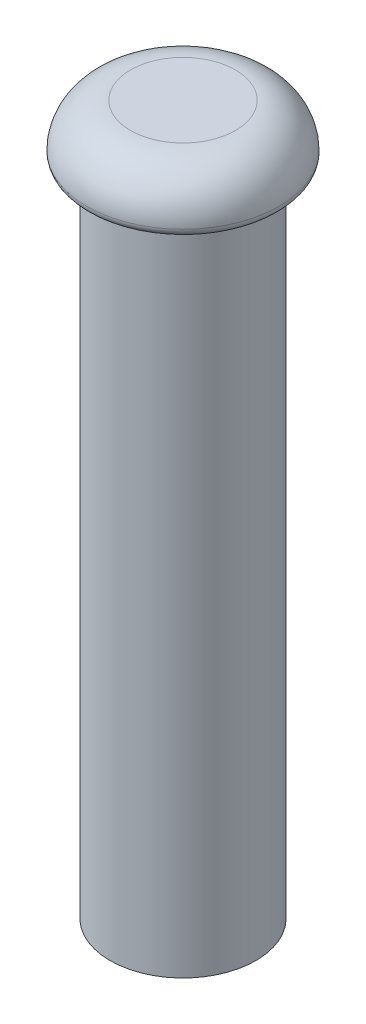
ISO-10303-21;
HEADER;
FILE_DESCRIPTION(('STEP AP214'),'2;1');
FILE_NAME('part.step','',(''),(''),'','','');
FILE_SCHEMA(('AUTOMOTIVE_DESIGN { 1 0 10303 214 1 1 1 1 }'));
ENDSEC;
DATA;
#1=APPLICATION_CONTEXT('core data for automotive mechanical design processes');
#2=APPLICATION_PROTOCOL_DEFINITION('international standard','automotive_design',2000,#1);
#3=PRODUCT_CONTEXT('',#1,'mechanical');
#4=PRODUCT('Part','Part','',(#3));
#5=PRODUCT_RELATED_PRODUCT_CATEGORY('part','',(#4));
#6=PRODUCT_DEFINITION_FORMATION('','',#4);
#7=PRODUCT_DEFINITION_CONTEXT('part definition',#1,'design');
#8=PRODUCT_DEFINITION('design','',#6,#7);
#9=PRODUCT_DEFINITION_SHAPE('','',#8);
#10=(LENGTH_UNIT() NAMED_UNIT(*) SI_UNIT(.MILLI.,.METRE.));
#11=(NAMED_UNIT(*) PLANE_ANGLE_UNIT() SI_UNIT($,.RADIAN.));
#12=(NAMED_UNIT(*) SI_UNIT($,.STERADIAN.) SOLID_ANGLE_UNIT());
#13=UNCERTAINTY_MEASURE_WITH_UNIT(LENGTH_MEASURE(1.E-05),#10,'distance_accuracy_value','');
#14=(GEOMETRIC_REPRESENTATION_CONTEXT(3) GLOBAL_UNCERTAINTY_ASSIGNED_CONTEXT((#13)) GLOBAL_UNIT_ASSIGNED_CONTEXT((#10,
#11,#12)) REPRESENTATION_CONTEXT('',''));
#15=CARTESIAN_POINT('',(0.,0.,0.));
#16=DIRECTION('',(0.,0.,1.));
#17=DIRECTION('',(1.,0.,0.));
#18=AXIS2_PLACEMENT_3D('',#15,#16,#17);
#19=CARTESIAN_POINT('',(0.,225.,0.));
#20=DIRECTION('',(0.,-1.,0.));
#21=DIRECTION('',(0.,0.,-1.));
#22=AXIS2_PLACEMENT_3D('',#19,#20,#21);
#23=CYLINDRICAL_SURFACE('',#22,25.);
#24=CARTESIAN_POINT('',(0.,225.,0.));
#25=DIRECTION('',(0.,1.,0.));
#26=DIRECTION('',(0.,0.,1.));
#27=AXIS2_PLACEMENT_3D('',#24,#25,#26);
#28=CIRCLE('',#27,25.);
#29=CARTESIAN_POINT('',(0.,225.,25.));
#30=VERTEX_POINT('',#29);
#31=EDGE_CURVE('E55',#30,#30,#28,.T.);
#32=ORIENTED_EDGE('',*,*,#31,.F.);
#33=EDGE_LOOP('',(#32));
#34=FACE_BOUND('',#33,.T.);
#35=CARTESIAN_POINT('',(0.,0.,0.));
#36=DIRECTION('',(0.,1.,0.));
#37=DIRECTION('',(0.,0.,1.));
#38=AXIS2_PLACEMENT_3D('',#35,#36,#37);
#39=CIRCLE('',#38,25.);
#40=CARTESIAN_POINT('',(0.,0.,25.));
#41=VERTEX_POINT('',#40);
#42=EDGE_CURVE('E58',#41,#41,#39,.T.);
#43=ORIENTED_EDGE('',*,*,#42,.T.);
#44=EDGE_LOOP('',(#43));
#45=FACE_BOUND('',#44,.T.);
#46=ADVANCED_FACE('F37',(#34,#45),#23,.T.);
#47=CARTESIAN_POINT('',(0.,0.,0.));
#48=DIRECTION('',(0.,1.,0.));
#49=DIRECTION('',(0.,0.,1.));
#50=AXIS2_PLACEMENT_3D('',#47,#48,#49);
#51=PLANE('',#50);
#52=ORIENTED_EDGE('',*,*,#42,.F.);
#53=EDGE_LOOP('',(#52));
#54=FACE_BOUND('',#53,.T.);
#55=ADVANCED_FACE('F70',(#54),#51,.F.);
#56=CARTESIAN_POINT('',(0.,243.,0.));
#57=DIRECTION('',(0.,1.,0.));
#58=DIRECTION('',(0.,0.,1.));
#59=AXIS2_PLACEMENT_3D('',#56,#57,#58);
#60=PLANE('',#59);
#61=CARTESIAN_POINT('',(0.,243.,0.));
#62=DIRECTION('',(0.,1.,0.));
#63=DIRECTION('',(0.,0.,1.));
#64=AXIS2_PLACEMENT_3D('',#61,#62,#63);
#65=CIRCLE('',#64,18.);
#66=CARTESIAN_POINT('',(0.,243.,18.));
#67=VERTEX_POINT('',#66);
#68=EDGE_CURVE('E50',#67,#67,#65,.T.);
#69=ORIENTED_EDGE('',*,*,#68,.T.);
#70=EDGE_LOOP('',(#69));
#71=FACE_BOUND('',#70,.T.);
#72=ADVANCED_FACE('F75',(#71),#60,.T.);
#73=CARTESIAN_POINT('',(0.,225.,0.));
#74=DIRECTION('',(0.,1.,0.));
#75=DIRECTION('',(0.,0.,1.));
#76=AXIS2_PLACEMENT_3D('',#73,#74,#75);
#77=PLANE('',#76);
#78=CARTESIAN_POINT('',(0.,225.,0.));
#79=DIRECTION('',(0.,1.,0.));
#80=DIRECTION('',(0.,0.,1.));
#81=AXIS2_PLACEMENT_3D('',#78,#79,#80);
#82=CIRCLE('',#81,30.);
#83=CARTESIAN_POINT('',(0.,225.,30.));
#84=VERTEX_POINT('',#83);
#85=EDGE_CURVE('E10',#84,#84,#82,.F.);
#86=ORIENTED_EDGE('',*,*,#85,.T.);
#87=EDGE_LOOP('',(#86));
#88=FACE_BOUND('',#87,.T.);
#89=ORIENTED_EDGE('',*,*,#31,.T.);
#90=EDGE_LOOP('',(#89));
#91=FACE_BOUND('',#90,.T.);
#92=ADVANCED_FACE('F66',(#88,#91),#77,.F.);
#93=CARTESIAN_POINT('',(0.,228.,0.));
#94=DIRECTION('',(0.,1.,0.));
#95=DIRECTION('',(0.,0.,1.));
#96=AXIS2_PLACEMENT_3D('',#93,#94,#95);
#97=TOROIDAL_SURFACE('',#96,18.,15.);
#98=CARTESIAN_POINT('',(0.,228.,0.));
#99=DIRECTION('',(0.,1.,0.));
#100=DIRECTION('',(0.,0.,1.));
#101=AXIS2_PLACEMENT_3D('',#98,#99,#100);
#102=CIRCLE('',#101,33.);
#103=CARTESIAN_POINT('',(0.,228.,33.));
#104=VERTEX_POINT('',#103);
#105=EDGE_CURVE('E45',#104,#104,#102,.F.);
#106=ORIENTED_EDGE('',*,*,#105,.F.);
#107=EDGE_LOOP('',(#106));
#108=FACE_BOUND('',#107,.T.);
#109=ORIENTED_EDGE('',*,*,#68,.F.);
#110=EDGE_LOOP('',(#109));
#111=FACE_BOUND('',#110,.T.);
#112=ADVANCED_FACE('F83',(#108,#111),#97,.T.);
#113=CARTESIAN_POINT('',(0.,228.,0.));
#114=DIRECTION('',(0.,1.,0.));
#115=DIRECTION('',(0.,0.,1.));
#116=AXIS2_PLACEMENT_3D('',#113,#114,#115);
#117=TOROIDAL_SURFACE('',#116,30.,3.);
#118=ORIENTED_EDGE('',*,*,#85,.F.);
#119=EDGE_LOOP('',(#118));
#120=FACE_BOUND('',#119,.T.);
#121=ORIENTED_EDGE('',*,*,#105,.T.);
#122=EDGE_LOOP('',(#121));
#123=FACE_BOUND('',#122,.T.);
#124=ADVANCED_FACE('F39',(#120,#123),#117,.T.);
#125=CLOSED_SHELL('',(#46,#55,#72,#92,#112,#124));
#126=MANIFOLD_SOLID_BREP('B2',#125);
#127=ADVANCED_BREP_SHAPE_REPRESENTATION('',(#18,#126),#14);
#128=SHAPE_DEFINITION_REPRESENTATION(#9,#127);
ENDSEC;
END-ISO-10303-21;
